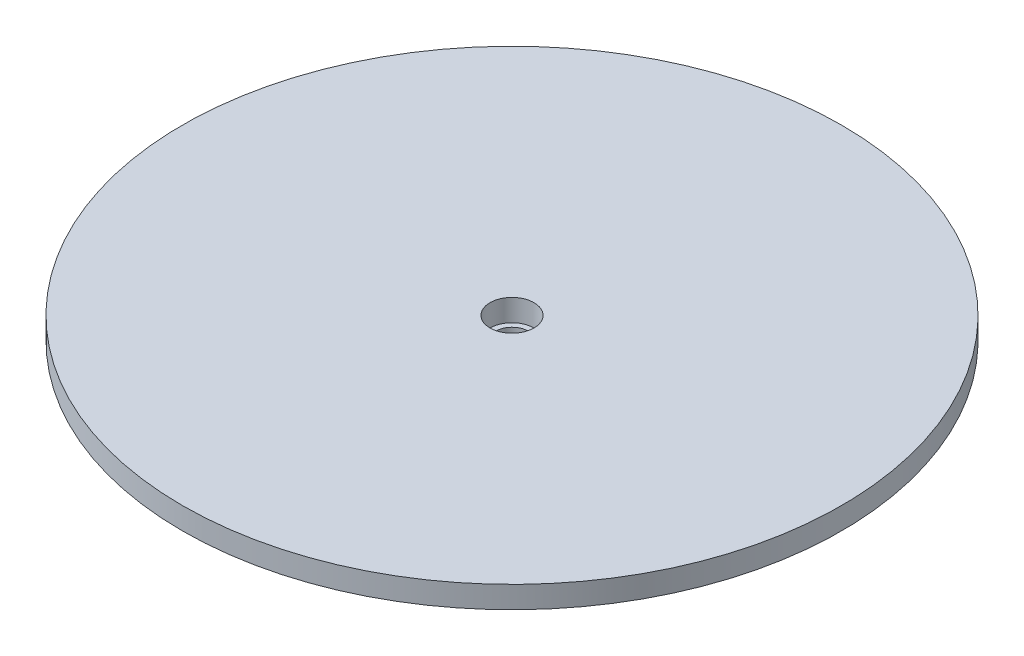
ISO-10303-21;
HEADER;
FILE_DESCRIPTION(('STEP AP214'),'2;1');
FILE_NAME('part.step','',(''),(''),'','','');
FILE_SCHEMA(('AUTOMOTIVE_DESIGN { 1 0 10303 214 1 1 1 1 }'));
ENDSEC;
DATA;
#1=APPLICATION_CONTEXT('core data for automotive mechanical design processes');
#2=APPLICATION_PROTOCOL_DEFINITION('international standard','automotive_design',2000,#1);
#3=PRODUCT_CONTEXT('',#1,'mechanical');
#4=PRODUCT('Part','Part','',(#3));
#5=PRODUCT_RELATED_PRODUCT_CATEGORY('part','',(#4));
#6=PRODUCT_DEFINITION_FORMATION('','',#4);
#7=PRODUCT_DEFINITION_CONTEXT('part definition',#1,'design');
#8=PRODUCT_DEFINITION('design','',#6,#7);
#9=PRODUCT_DEFINITION_SHAPE('','',#8);
#10=(LENGTH_UNIT() NAMED_UNIT(*) SI_UNIT(.MILLI.,.METRE.));
#11=(NAMED_UNIT(*) PLANE_ANGLE_UNIT() SI_UNIT($,.RADIAN.));
#12=(NAMED_UNIT(*) SI_UNIT($,.STERADIAN.) SOLID_ANGLE_UNIT());
#13=UNCERTAINTY_MEASURE_WITH_UNIT(LENGTH_MEASURE(1.E-05),#10,'distance_accuracy_value','');
#14=(GEOMETRIC_REPRESENTATION_CONTEXT(3) GLOBAL_UNCERTAINTY_ASSIGNED_CONTEXT((#13)) GLOBAL_UNIT_ASSIGNED_CONTEXT((#10,
#11,#12)) REPRESENTATION_CONTEXT('',''));
#15=CARTESIAN_POINT('',(0.,0.,0.));
#16=DIRECTION('',(0.,0.,1.));
#17=DIRECTION('',(1.,0.,0.));
#18=AXIS2_PLACEMENT_3D('',#15,#16,#17);
#19=CARTESIAN_POINT('',(0.,-2.,0.));
#20=DIRECTION('',(0.,1.,0.));
#21=DIRECTION('',(0.,0.,1.));
#22=AXIS2_PLACEMENT_3D('',#19,#20,#21);
#23=CYLINDRICAL_SURFACE('',#22,1.5);
#24=CARTESIAN_POINT('',(0.,-2.,0.));
#25=DIRECTION('',(0.,1.,0.));
#26=DIRECTION('',(0.,0.,1.));
#27=AXIS2_PLACEMENT_3D('',#24,#25,#26);
#28=CIRCLE('',#27,1.5);
#29=CARTESIAN_POINT('',(0.,-2.,1.5));
#30=VERTEX_POINT('',#29);
#31=EDGE_CURVE('E117',#30,#30,#28,.T.);
#32=ORIENTED_EDGE('',*,*,#31,.F.);
#33=EDGE_LOOP('',(#32));
#34=FACE_BOUND('',#33,.T.);
#35=CARTESIAN_POINT('',(0.,0.,0.));
#36=DIRECTION('',(0.,1.,0.));
#37=DIRECTION('',(0.,0.,1.));
#38=AXIS2_PLACEMENT_3D('',#35,#36,#37);
#39=CIRCLE('',#38,1.5);
#40=CARTESIAN_POINT('',(0.,0.,1.5));
#41=VERTEX_POINT('',#40);
#42=EDGE_CURVE('E43',#41,#41,#39,.F.);
#43=ORIENTED_EDGE('',*,*,#42,.F.);
#44=EDGE_LOOP('',(#43));
#45=FACE_BOUND('',#44,.T.);
#46=ADVANCED_FACE('F39',(#34,#45),#23,.F.);
#47=CARTESIAN_POINT('',(0.,0.,0.));
#48=DIRECTION('',(0.,1.,0.));
#49=DIRECTION('',(0.,0.,1.));
#50=AXIS2_PLACEMENT_3D('',#47,#48,#49);
#51=PLANE('',#50);
#52=CARTESIAN_POINT('',(0.,0.,0.));
#53=DIRECTION('',(0.,1.,0.));
#54=DIRECTION('',(0.,0.,1.));
#55=AXIS2_PLACEMENT_3D('',#52,#53,#54);
#56=CIRCLE('',#55,30.);
#57=CARTESIAN_POINT('',(0.,0.,30.));
#58=VERTEX_POINT('',#57);
#59=EDGE_CURVE('E48',#58,#58,#56,.T.);
#60=ORIENTED_EDGE('',*,*,#59,.F.);
#61=EDGE_LOOP('',(#60));
#62=FACE_BOUND('',#61,.T.);
#63=DIRECTION('',(0.,0.,1.));
#64=VECTOR('',#63,1.);
#65=CARTESIAN_POINT('',(3.,0.,-3.));
#66=LINE('',#65,#64);
#67=CARTESIAN_POINT('',(3.,0.,-3.));
#68=VERTEX_POINT('',#67);
#69=CARTESIAN_POINT('',(3.,0.,3.));
#70=VERTEX_POINT('',#69);
#71=EDGE_CURVE('E102',#68,#70,#66,.T.);
#72=ORIENTED_EDGE('',*,*,#71,.F.);
#73=DIRECTION('',(1.,0.,0.));
#74=VECTOR('',#73,1.);
#75=CARTESIAN_POINT('',(-3.,0.,-3.));
#76=LINE('',#75,#74);
#77=CARTESIAN_POINT('',(-3.,0.,-3.));
#78=VERTEX_POINT('',#77);
#79=EDGE_CURVE('E99',#78,#68,#76,.T.);
#80=ORIENTED_EDGE('',*,*,#79,.F.);
#81=DIRECTION('',(0.,0.,-1.));
#82=VECTOR('',#81,1.);
#83=CARTESIAN_POINT('',(-3.,0.,-3.));
#84=LINE('',#83,#82);
#85=CARTESIAN_POINT('',(-3.,0.,3.));
#86=VERTEX_POINT('',#85);
#87=EDGE_CURVE('E61',#86,#78,#84,.T.);
#88=ORIENTED_EDGE('',*,*,#87,.F.);
#89=DIRECTION('',(-1.,0.,0.));
#90=VECTOR('',#89,1.);
#91=CARTESIAN_POINT('',(-3.,0.,3.));
#92=LINE('',#91,#90);
#93=EDGE_CURVE('E56',#70,#86,#92,.T.);
#94=ORIENTED_EDGE('',*,*,#93,.F.);
#95=EDGE_LOOP('',(#72,#80,#88,#94));
#96=FACE_BOUND('',#95,.T.);
#97=ADVANCED_FACE('F135',(#62,#96),#51,.F.);
#98=CARTESIAN_POINT('',(0.,2.,0.));
#99=DIRECTION('',(0.,-1.,0.));
#100=DIRECTION('',(0.,0.,-1.));
#101=AXIS2_PLACEMENT_3D('',#98,#99,#100);
#102=CYLINDRICAL_SURFACE('',#101,30.);
#103=CARTESIAN_POINT('',(0.,2.,0.));
#104=DIRECTION('',(0.,1.,0.));
#105=DIRECTION('',(0.,0.,1.));
#106=AXIS2_PLACEMENT_3D('',#103,#104,#105);
#107=CIRCLE('',#106,30.);
#108=CARTESIAN_POINT('',(0.,2.,30.));
#109=VERTEX_POINT('',#108);
#110=EDGE_CURVE('E11',#109,#109,#107,.T.);
#111=ORIENTED_EDGE('',*,*,#110,.F.);
#112=EDGE_LOOP('',(#111));
#113=FACE_BOUND('',#112,.T.);
#114=ORIENTED_EDGE('',*,*,#59,.T.);
#115=EDGE_LOOP('',(#114));
#116=FACE_BOUND('',#115,.T.);
#117=ADVANCED_FACE('F41',(#113,#116),#102,.T.);
#118=CARTESIAN_POINT('',(0.,2.,0.));
#119=DIRECTION('',(0.,1.,0.));
#120=DIRECTION('',(0.,0.,1.));
#121=AXIS2_PLACEMENT_3D('',#118,#119,#120);
#122=PLANE('',#121);
#123=CARTESIAN_POINT('',(0.,2.,0.));
#124=DIRECTION('',(0.,1.,0.));
#125=DIRECTION('',(0.,0.,1.));
#126=AXIS2_PLACEMENT_3D('',#123,#124,#125);
#127=CIRCLE('',#126,2.);
#128=CARTESIAN_POINT('',(0.,2.,2.));
#129=VERTEX_POINT('',#128);
#130=EDGE_CURVE('E122',#129,#129,#127,.T.);
#131=ORIENTED_EDGE('',*,*,#130,.F.);
#132=EDGE_LOOP('',(#131));
#133=FACE_BOUND('',#132,.T.);
#134=ORIENTED_EDGE('',*,*,#110,.T.);
#135=EDGE_LOOP('',(#134));
#136=FACE_BOUND('',#135,.T.);
#137=ADVANCED_FACE('F162',(#133,#136),#122,.T.);
#138=CARTESIAN_POINT('',(3.,-2.,-3.));
#139=DIRECTION('',(-1.,0.,0.));
#140=DIRECTION('',(0.,0.,1.));
#141=AXIS2_PLACEMENT_3D('',#138,#139,#140);
#142=PLANE('',#141);
#143=ORIENTED_EDGE('',*,*,#71,.T.);
#144=DIRECTION('',(0.,1.,0.));
#145=VECTOR('',#144,1.);
#146=CARTESIAN_POINT('',(3.,-2.,3.));
#147=LINE('',#146,#145);
#148=CARTESIAN_POINT('',(3.,-2.,3.));
#149=VERTEX_POINT('',#148);
#150=EDGE_CURVE('E83',#149,#70,#147,.T.);
#151=ORIENTED_EDGE('',*,*,#150,.F.);
#152=DIRECTION('',(0.,0.,1.));
#153=VECTOR('',#152,1.);
#154=CARTESIAN_POINT('',(3.,-2.,-3.));
#155=LINE('',#154,#153);
#156=CARTESIAN_POINT('',(3.,-2.,-3.));
#157=VERTEX_POINT('',#156);
#158=EDGE_CURVE('E90',#157,#149,#155,.T.);
#159=ORIENTED_EDGE('',*,*,#158,.F.);
#160=DIRECTION('',(0.,1.,0.));
#161=VECTOR('',#160,1.);
#162=CARTESIAN_POINT('',(3.,-2.,-3.));
#163=LINE('',#162,#161);
#164=EDGE_CURVE('E110',#157,#68,#163,.T.);
#165=ORIENTED_EDGE('',*,*,#164,.T.);
#166=EDGE_LOOP('',(#143,#151,#159,#165));
#167=FACE_BOUND('',#166,.T.);
#168=ADVANCED_FACE('F101',(#167),#142,.F.);
#169=CARTESIAN_POINT('',(-3.,-2.,3.));
#170=DIRECTION('',(0.,0.,-1.));
#171=DIRECTION('',(-1.,0.,0.));
#172=AXIS2_PLACEMENT_3D('',#169,#170,#171);
#173=PLANE('',#172);
#174=ORIENTED_EDGE('',*,*,#93,.T.);
#175=DIRECTION('',(0.,1.,0.));
#176=VECTOR('',#175,1.);
#177=CARTESIAN_POINT('',(-3.,-2.,3.));
#178=LINE('',#177,#176);
#179=CARTESIAN_POINT('',(-3.,-2.,3.));
#180=VERTEX_POINT('',#179);
#181=EDGE_CURVE('E86',#180,#86,#178,.T.);
#182=ORIENTED_EDGE('',*,*,#181,.F.);
#183=DIRECTION('',(-1.,0.,0.));
#184=VECTOR('',#183,1.);
#185=CARTESIAN_POINT('',(-3.,-2.,3.));
#186=LINE('',#185,#184);
#187=EDGE_CURVE('E79',#149,#180,#186,.T.);
#188=ORIENTED_EDGE('',*,*,#187,.F.);
#189=ORIENTED_EDGE('',*,*,#150,.T.);
#190=EDGE_LOOP('',(#174,#182,#188,#189));
#191=FACE_BOUND('',#190,.T.);
#192=ADVANCED_FACE('F81',(#191),#173,.F.);
#193=CARTESIAN_POINT('',(-3.,-2.,-3.));
#194=DIRECTION('',(1.,0.,0.));
#195=DIRECTION('',(0.,0.,-1.));
#196=AXIS2_PLACEMENT_3D('',#193,#194,#195);
#197=PLANE('',#196);
#198=ORIENTED_EDGE('',*,*,#87,.T.);
#199=DIRECTION('',(0.,1.,0.));
#200=VECTOR('',#199,1.);
#201=CARTESIAN_POINT('',(-3.,-2.,-3.));
#202=LINE('',#201,#200);
#203=CARTESIAN_POINT('',(-3.,-2.,-3.));
#204=VERTEX_POINT('',#203);
#205=EDGE_CURVE('E105',#204,#78,#202,.T.);
#206=ORIENTED_EDGE('',*,*,#205,.F.);
#207=DIRECTION('',(0.,0.,-1.));
#208=VECTOR('',#207,1.);
#209=CARTESIAN_POINT('',(-3.,-2.,-3.));
#210=LINE('',#209,#208);
#211=EDGE_CURVE('E89',#180,#204,#210,.T.);
#212=ORIENTED_EDGE('',*,*,#211,.F.);
#213=ORIENTED_EDGE('',*,*,#181,.T.);
#214=EDGE_LOOP('',(#198,#206,#212,#213));
#215=FACE_BOUND('',#214,.T.);
#216=ADVANCED_FACE('F153',(#215),#197,.F.);
#217=CARTESIAN_POINT('',(-3.,-2.,-3.));
#218=DIRECTION('',(0.,0.,1.));
#219=DIRECTION('',(1.,0.,0.));
#220=AXIS2_PLACEMENT_3D('',#217,#218,#219);
#221=PLANE('',#220);
#222=ORIENTED_EDGE('',*,*,#79,.T.);
#223=ORIENTED_EDGE('',*,*,#164,.F.);
#224=DIRECTION('',(1.,0.,0.));
#225=VECTOR('',#224,1.);
#226=CARTESIAN_POINT('',(-3.,-2.,-3.));
#227=LINE('',#226,#225);
#228=EDGE_CURVE('E95',#204,#157,#227,.T.);
#229=ORIENTED_EDGE('',*,*,#228,.F.);
#230=ORIENTED_EDGE('',*,*,#205,.T.);
#231=EDGE_LOOP('',(#222,#223,#229,#230));
#232=FACE_BOUND('',#231,.T.);
#233=ADVANCED_FACE('F149',(#232),#221,.F.);
#234=CARTESIAN_POINT('',(0.,-2.,0.));
#235=DIRECTION('',(0.,1.,0.));
#236=DIRECTION('',(0.,0.,1.));
#237=AXIS2_PLACEMENT_3D('',#234,#235,#236);
#238=PLANE('',#237);
#239=ORIENTED_EDGE('',*,*,#31,.T.);
#240=EDGE_LOOP('',(#239));
#241=FACE_BOUND('',#240,.T.);
#242=ORIENTED_EDGE('',*,*,#158,.T.);
#243=ORIENTED_EDGE('',*,*,#187,.T.);
#244=ORIENTED_EDGE('',*,*,#211,.T.);
#245=ORIENTED_EDGE('',*,*,#228,.T.);
#246=EDGE_LOOP('',(#242,#243,#244,#245));
#247=FACE_BOUND('',#246,.T.);
#248=ADVANCED_FACE('F93',(#241,#247),#238,.F.);
#249=CARTESIAN_POINT('',(0.,0.,0.));
#250=DIRECTION('',(0.,1.,0.));
#251=DIRECTION('',(0.,0.,1.));
#252=AXIS2_PLACEMENT_3D('',#249,#250,#251);
#253=PLANE('',#252);
#254=CARTESIAN_POINT('',(0.,0.,0.));
#255=DIRECTION('',(0.,1.,0.));
#256=DIRECTION('',(0.,0.,1.));
#257=AXIS2_PLACEMENT_3D('',#254,#255,#256);
#258=CIRCLE('',#257,2.);
#259=CARTESIAN_POINT('',(0.,0.,2.));
#260=VERTEX_POINT('',#259);
#261=EDGE_CURVE('E125',#260,#260,#258,.T.);
#262=ORIENTED_EDGE('',*,*,#261,.T.);
#263=EDGE_LOOP('',(#262));
#264=FACE_BOUND('',#263,.T.);
#265=ORIENTED_EDGE('',*,*,#42,.T.);
#266=EDGE_LOOP('',(#265));
#267=FACE_BOUND('',#266,.T.);
#268=ADVANCED_FACE('F132',(#264,#267),#253,.T.);
#269=CARTESIAN_POINT('',(0.,0.,0.));
#270=DIRECTION('',(0.,1.,0.));
#271=DIRECTION('',(0.,0.,1.));
#272=AXIS2_PLACEMENT_3D('',#269,#270,#271);
#273=CYLINDRICAL_SURFACE('',#272,2.);
#274=ORIENTED_EDGE('',*,*,#261,.F.);
#275=EDGE_LOOP('',(#274));
#276=FACE_BOUND('',#275,.T.);
#277=ORIENTED_EDGE('',*,*,#130,.T.);
#278=EDGE_LOOP('',(#277));
#279=FACE_BOUND('',#278,.T.);
#280=ADVANCED_FACE('F145',(#276,#279),#273,.F.);
#281=CLOSED_SHELL('',(#46,#97,#117,#137,#168,#192,#216,#233,#248,#268,#280));
#282=MANIFOLD_SOLID_BREP('B2',#281);
#283=ADVANCED_BREP_SHAPE_REPRESENTATION('',(#18,#282),#14);
#284=SHAPE_DEFINITION_REPRESENTATION(#9,#283);
ENDSEC;
END-ISO-10303-21;
